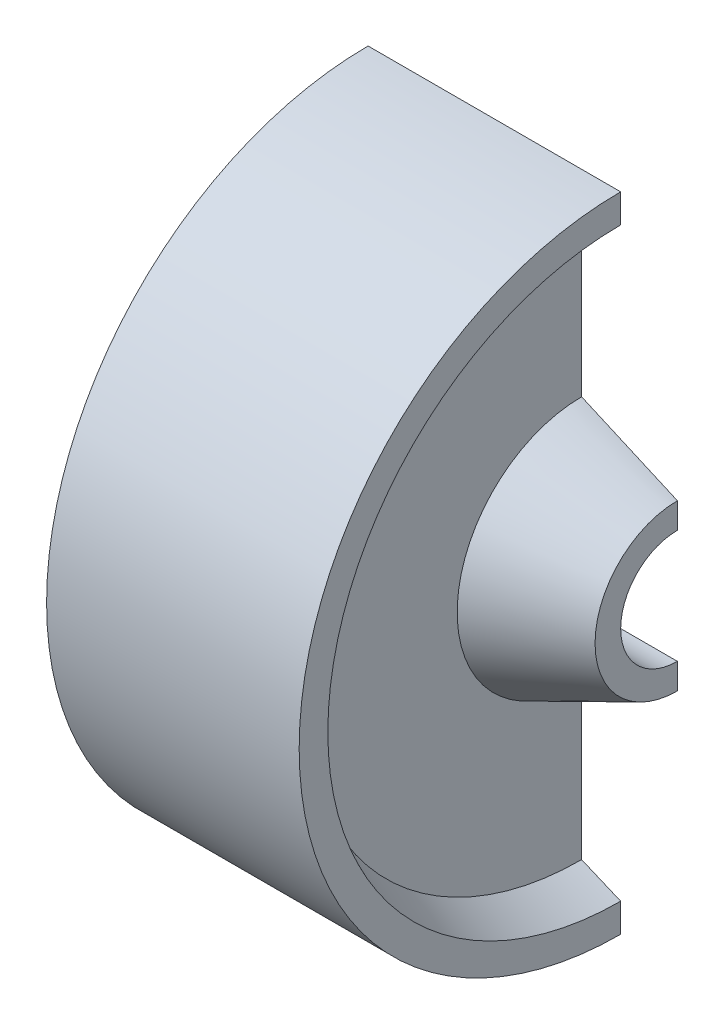
ISO-10303-21;
HEADER;
FILE_DESCRIPTION(('STEP AP214'),'2;1');
FILE_NAME('part.step','',(''),(''),'','','');
FILE_SCHEMA(('AUTOMOTIVE_DESIGN { 1 0 10303 214 1 1 1 1 }'));
ENDSEC;
DATA;
#1=APPLICATION_CONTEXT('core data for automotive mechanical design processes');
#2=APPLICATION_PROTOCOL_DEFINITION('international standard','automotive_design',2000,#1);
#3=PRODUCT_CONTEXT('',#1,'mechanical');
#4=PRODUCT('Part','Part','',(#3));
#5=PRODUCT_RELATED_PRODUCT_CATEGORY('part','',(#4));
#6=PRODUCT_DEFINITION_FORMATION('','',#4);
#7=PRODUCT_DEFINITION_CONTEXT('part definition',#1,'design');
#8=PRODUCT_DEFINITION('design','',#6,#7);
#9=PRODUCT_DEFINITION_SHAPE('','',#8);
#10=(LENGTH_UNIT() NAMED_UNIT(*) SI_UNIT(.MILLI.,.METRE.));
#11=(NAMED_UNIT(*) PLANE_ANGLE_UNIT() SI_UNIT($,.RADIAN.));
#12=(NAMED_UNIT(*) SI_UNIT($,.STERADIAN.) SOLID_ANGLE_UNIT());
#13=UNCERTAINTY_MEASURE_WITH_UNIT(LENGTH_MEASURE(1.E-05),#10,'distance_accuracy_value','');
#14=(GEOMETRIC_REPRESENTATION_CONTEXT(3) GLOBAL_UNCERTAINTY_ASSIGNED_CONTEXT((#13)) GLOBAL_UNIT_ASSIGNED_CONTEXT((#10,
#11,#12)) REPRESENTATION_CONTEXT('',''));
#15=CARTESIAN_POINT('',(0.,0.,0.));
#16=DIRECTION('',(0.,0.,1.));
#17=DIRECTION('',(1.,0.,0.));
#18=AXIS2_PLACEMENT_3D('',#15,#16,#17);
#19=CARTESIAN_POINT('',(61.9764680866145,-19.2127051068383,-1.34161602698444E-13));
#20=DIRECTION('',(-1.,0.,0.));
#21=DIRECTION('',(0.,0.,1.));
#22=AXIS2_PLACEMENT_3D('',#19,#20,#21);
#23=PLANE('',#22);
#24=CARTESIAN_POINT('',(61.9764680866145,0.,0.));
#25=DIRECTION('',(-1.,0.,0.));
#26=DIRECTION('',(0.,0.,1.));
#27=AXIS2_PLACEMENT_3D('',#24,#25,#26);
#28=CIRCLE('',#27,27.889410638975);
#29=CARTESIAN_POINT('',(61.9764680866145,-27.889410638975,-1.94750713594629E-13));
#30=VERTEX_POINT('',#29);
#31=CARTESIAN_POINT('',(61.9764680866145,27.889410638975,0.));
#32=VERTEX_POINT('',#31);
#33=EDGE_CURVE('E11',#30,#32,#28,.T.);
#34=ORIENTED_EDGE('',*,*,#33,.F.);
#35=DIRECTION('',(0.,-1.,0.));
#36=VECTOR('',#35,1.);
#37=CARTESIAN_POINT('',(61.9764680866145,-19.2127051068383,-1.34161602698444E-13));
#38=LINE('',#37,#36);
#39=CARTESIAN_POINT('',(61.9764680866145,-19.2127051068383,-1.34161602698444E-13));
#40=VERTEX_POINT('',#39);
#41=EDGE_CURVE('E170',#40,#30,#38,.T.);
#42=ORIENTED_EDGE('',*,*,#41,.F.);
#43=CARTESIAN_POINT('',(61.9764680866145,0.,0.));
#44=DIRECTION('',(-1.,0.,0.));
#45=DIRECTION('',(0.,0.,1.));
#46=AXIS2_PLACEMENT_3D('',#43,#44,#45);
#47=CIRCLE('',#46,19.2127051068383);
#48=CARTESIAN_POINT('',(61.9764680866145,19.2127051068383,0.));
#49=VERTEX_POINT('',#48);
#50=EDGE_CURVE('E50',#40,#49,#47,.T.);
#51=ORIENTED_EDGE('',*,*,#50,.T.);
#52=DIRECTION('',(0.,1.,0.));
#53=VECTOR('',#52,1.);
#54=CARTESIAN_POINT('',(61.9764680866145,19.2127051068383,0.));
#55=LINE('',#54,#53);
#56=EDGE_CURVE('E134',#49,#32,#55,.T.);
#57=ORIENTED_EDGE('',*,*,#56,.T.);
#58=EDGE_LOOP('',(#34,#42,#51,#57));
#59=FACE_BOUND('',#58,.T.);
#60=ADVANCED_FACE('F35',(#59),#23,.F.);
#61=CARTESIAN_POINT('',(61.9764680866145,0.,0.));
#62=DIRECTION('',(-1.,0.,0.));
#63=DIRECTION('',(0.,0.,1.));
#64=AXIS2_PLACEMENT_3D('',#61,#62,#63);
#65=CONICAL_SURFACE('',#64,27.889410638975,0.414079889128241);
#66=CARTESIAN_POINT('',(29.5421164546196,0.,0.));
#67=DIRECTION('',(-1.,0.,0.));
#68=DIRECTION('',(0.,0.,1.));
#69=AXIS2_PLACEMENT_3D('',#66,#67,#68);
#70=CIRCLE('',#69,42.1439982988964);
#71=CARTESIAN_POINT('',(29.5421164546196,-42.1439982988964,-2.94289967209667E-13));
#72=VERTEX_POINT('',#71);
#73=CARTESIAN_POINT('',(29.5421164546196,42.1439982988964,0.));
#74=VERTEX_POINT('',#73);
#75=EDGE_CURVE('E43',#72,#74,#70,.T.);
#76=ORIENTED_EDGE('',*,*,#75,.F.);
#77=DIRECTION('',(-0.915486912510069,-0.402347751357928,0.));
#78=VECTOR('',#77,1.);
#79=CARTESIAN_POINT('',(61.9764680866145,-27.889410638975,-1.94750713594629E-13));
#80=LINE('',#79,#78);
#81=EDGE_CURVE('E130',#30,#72,#80,.T.);
#82=ORIENTED_EDGE('',*,*,#81,.F.);
#83=ORIENTED_EDGE('',*,*,#33,.T.);
#84=DIRECTION('',(-0.915486912510069,0.402347751357928,0.));
#85=VECTOR('',#84,1.);
#86=CARTESIAN_POINT('',(61.9764680866145,27.889410638975,0.));
#87=LINE('',#86,#85);
#88=EDGE_CURVE('E127',#32,#74,#87,.T.);
#89=ORIENTED_EDGE('',*,*,#88,.T.);
#90=EDGE_LOOP('',(#76,#82,#83,#89));
#91=FACE_BOUND('',#90,.T.);
#92=ADVANCED_FACE('F37',(#91),#65,.T.);
#93=CARTESIAN_POINT('',(29.5421164546196,-42.1439982988964,-2.94289967209667E-13));
#94=DIRECTION('',(-1.,0.,0.));
#95=DIRECTION('',(0.,0.,1.));
#96=AXIS2_PLACEMENT_3D('',#93,#94,#95);
#97=PLANE('',#96);
#98=CARTESIAN_POINT('',(29.5421164546196,0.,0.));
#99=DIRECTION('',(-1.,0.,0.));
#100=DIRECTION('',(0.,0.,1.));
#101=AXIS2_PLACEMENT_3D('',#98,#99,#100);
#102=CIRCLE('',#101,93.5844668107864);
#103=CARTESIAN_POINT('',(29.5421164546196,-93.5844668107864,-6.5349683895089E-13));
#104=VERTEX_POINT('',#103);
#105=CARTESIAN_POINT('',(29.5421164546196,93.5844668107864,0.));
#106=VERTEX_POINT('',#105);
#107=EDGE_CURVE('E218',#104,#106,#102,.T.);
#108=ORIENTED_EDGE('',*,*,#107,.F.);
#109=DIRECTION('',(0.,-1.,0.));
#110=VECTOR('',#109,1.);
#111=CARTESIAN_POINT('',(29.5421164546196,-42.1439982988964,-2.94289967209667E-13));
#112=LINE('',#111,#110);
#113=EDGE_CURVE('E173',#72,#104,#112,.T.);
#114=ORIENTED_EDGE('',*,*,#113,.F.);
#115=ORIENTED_EDGE('',*,*,#75,.T.);
#116=DIRECTION('',(0.,1.,0.));
#117=VECTOR('',#116,1.);
#118=CARTESIAN_POINT('',(29.5421164546196,42.1439982988964,0.));
#119=LINE('',#118,#117);
#120=EDGE_CURVE('E141',#74,#106,#119,.T.);
#121=ORIENTED_EDGE('',*,*,#120,.T.);
#122=EDGE_LOOP('',(#108,#114,#115,#121));
#123=FACE_BOUND('',#122,.T.);
#124=ADVANCED_FACE('F221',(#123),#97,.F.);
#125=CARTESIAN_POINT('',(29.5421164546196,0.,0.));
#126=DIRECTION('',(1.,0.,0.));
#127=DIRECTION('',(0.,0.,-1.));
#128=AXIS2_PLACEMENT_3D('',#125,#126,#127);
#129=CONICAL_SURFACE('',#128,93.5844668107864,0.399220769575252);
#130=CARTESIAN_POINT('',(42.763762979764,0.,0.));
#131=DIRECTION('',(-1.,0.,0.));
#132=DIRECTION('',(0.,0.,1.));
#133=AXIS2_PLACEMENT_3D('',#130,#131,#132);
#134=CIRCLE('',#133,99.1623489385817);
#135=CARTESIAN_POINT('',(42.763762979764,-99.1623489385817,-6.92446981669818E-13));
#136=VERTEX_POINT('',#135);
#137=CARTESIAN_POINT('',(42.763762979764,99.1623489385817,0.));
#138=VERTEX_POINT('',#137);
#139=EDGE_CURVE('E216',#136,#138,#134,.T.);
#140=ORIENTED_EDGE('',*,*,#139,.F.);
#141=DIRECTION('',(0.921364160958329,-0.388700505404295,0.));
#142=VECTOR('',#141,1.);
#143=CARTESIAN_POINT('',(29.5421164546196,-93.5844668107864,-6.5349683895089E-13));
#144=LINE('',#143,#142);
#145=EDGE_CURVE('E176',#104,#136,#144,.T.);
#146=ORIENTED_EDGE('',*,*,#145,.F.);
#147=ORIENTED_EDGE('',*,*,#107,.T.);
#148=DIRECTION('',(0.921364160958329,0.388700505404295,0.));
#149=VECTOR('',#148,1.);
#150=CARTESIAN_POINT('',(29.5421164546196,93.5844668107864,0.));
#151=LINE('',#150,#149);
#152=EDGE_CURVE('E143',#106,#138,#151,.T.);
#153=ORIENTED_EDGE('',*,*,#152,.T.);
#154=EDGE_LOOP('',(#140,#146,#147,#153));
#155=FACE_BOUND('',#154,.T.);
#156=ADVANCED_FACE('F253',(#155),#129,.F.);
#157=CARTESIAN_POINT('',(42.763762979764,-99.1623489385817,-6.92446981669818E-13));
#158=DIRECTION('',(-1.,0.,0.));
#159=DIRECTION('',(0.,0.,1.));
#160=AXIS2_PLACEMENT_3D('',#157,#158,#159);
#161=PLANE('',#160);
#162=CARTESIAN_POINT('',(42.763762979764,0.,0.));
#163=DIRECTION('',(-1.,0.,0.));
#164=DIRECTION('',(0.,0.,1.));
#165=AXIS2_PLACEMENT_3D('',#162,#163,#164);
#166=CIRCLE('',#165,108.871995605485);
#167=CARTESIAN_POINT('',(42.763762979764,-108.871995605485,-7.60249081958322E-13));
#168=VERTEX_POINT('',#167);
#169=CARTESIAN_POINT('',(42.763762979764,108.871995605485,0.));
#170=VERTEX_POINT('',#169);
#171=EDGE_CURVE('E214',#168,#170,#166,.T.);
#172=ORIENTED_EDGE('',*,*,#171,.F.);
#173=DIRECTION('',(0.,-1.,0.));
#174=VECTOR('',#173,1.);
#175=CARTESIAN_POINT('',(42.763762979764,-99.1623489385817,-6.92446981669818E-13));
#176=LINE('',#175,#174);
#177=EDGE_CURVE('E179',#136,#168,#176,.T.);
#178=ORIENTED_EDGE('',*,*,#177,.F.);
#179=ORIENTED_EDGE('',*,*,#139,.T.);
#180=DIRECTION('',(0.,1.,0.));
#181=VECTOR('',#180,1.);
#182=CARTESIAN_POINT('',(42.763762979764,99.1623489385817,0.));
#183=LINE('',#182,#181);
#184=EDGE_CURVE('E148',#138,#170,#183,.T.);
#185=ORIENTED_EDGE('',*,*,#184,.T.);
#186=EDGE_LOOP('',(#172,#178,#179,#185));
#187=FACE_BOUND('',#186,.T.);
#188=ADVANCED_FACE('F251',(#187),#161,.F.);
#189=CARTESIAN_POINT('',(0.,0.,0.));
#190=DIRECTION('',(-1.,0.,0.));
#191=DIRECTION('',(0.,0.,1.));
#192=AXIS2_PLACEMENT_3D('',#189,#190,#191);
#193=CYLINDRICAL_SURFACE('',#192,108.871995605485);
#194=CARTESIAN_POINT('',(-42.763762979764,0.,0.));
#195=DIRECTION('',(-1.,0.,0.));
#196=DIRECTION('',(0.,0.,1.));
#197=AXIS2_PLACEMENT_3D('',#194,#195,#196);
#198=CIRCLE('',#197,108.871995605485);
#199=CARTESIAN_POINT('',(-42.763762979764,-108.871995605485,-7.60249081958322E-13));
#200=VERTEX_POINT('',#199);
#201=CARTESIAN_POINT('',(-42.763762979764,108.871995605485,0.));
#202=VERTEX_POINT('',#201);
#203=EDGE_CURVE('E212',#200,#202,#198,.T.);
#204=ORIENTED_EDGE('',*,*,#203,.F.);
#205=DIRECTION('',(-1.,0.,0.));
#206=VECTOR('',#205,1.);
#207=CARTESIAN_POINT('',(42.763762979764,-108.871995605485,-7.60249081958322E-13));
#208=LINE('',#207,#206);
#209=EDGE_CURVE('E182',#168,#200,#208,.T.);
#210=ORIENTED_EDGE('',*,*,#209,.F.);
#211=ORIENTED_EDGE('',*,*,#171,.T.);
#212=DIRECTION('',(-1.,0.,0.));
#213=VECTOR('',#212,1.);
#214=CARTESIAN_POINT('',(42.763762979764,108.871995605485,0.));
#215=LINE('',#214,#213);
#216=EDGE_CURVE('E151',#170,#202,#215,.T.);
#217=ORIENTED_EDGE('',*,*,#216,.T.);
#218=EDGE_LOOP('',(#204,#210,#211,#217));
#219=FACE_BOUND('',#218,.T.);
#220=ADVANCED_FACE('F248',(#219),#193,.T.);
#221=CARTESIAN_POINT('',(-42.763762979764,-99.1623489385817,-6.92446981669818E-13));
#222=DIRECTION('',(1.,0.,0.));
#223=DIRECTION('',(0.,0.,-1.));
#224=AXIS2_PLACEMENT_3D('',#221,#222,#223);
#225=PLANE('',#224);
#226=CARTESIAN_POINT('',(-42.763762979764,0.,0.));
#227=DIRECTION('',(-1.,0.,0.));
#228=DIRECTION('',(0.,0.,1.));
#229=AXIS2_PLACEMENT_3D('',#226,#227,#228);
#230=CIRCLE('',#229,99.1623489385817);
#231=CARTESIAN_POINT('',(-42.763762979764,-99.1623489385817,-6.92446981669818E-13));
#232=VERTEX_POINT('',#231);
#233=CARTESIAN_POINT('',(-42.763762979764,99.1623489385817,0.));
#234=VERTEX_POINT('',#233);
#235=EDGE_CURVE('E210',#232,#234,#230,.T.);
#236=ORIENTED_EDGE('',*,*,#235,.F.);
#237=DIRECTION('',(0.,1.,0.));
#238=VECTOR('',#237,1.);
#239=CARTESIAN_POINT('',(-42.763762979764,-99.1623489385817,-6.92446981669818E-13));
#240=LINE('',#239,#238);
#241=EDGE_CURVE('E185',#200,#232,#240,.T.);
#242=ORIENTED_EDGE('',*,*,#241,.F.);
#243=ORIENTED_EDGE('',*,*,#203,.T.);
#244=DIRECTION('',(0.,-1.,0.));
#245=VECTOR('',#244,1.);
#246=CARTESIAN_POINT('',(-42.763762979764,99.1623489385817,0.));
#247=LINE('',#246,#245);
#248=EDGE_CURVE('E154',#202,#234,#247,.T.);
#249=ORIENTED_EDGE('',*,*,#248,.T.);
#250=EDGE_LOOP('',(#236,#242,#243,#249));
#251=FACE_BOUND('',#250,.T.);
#252=ADVANCED_FACE('F244',(#251),#225,.F.);
#253=CARTESIAN_POINT('',(-42.763762979764,0.,0.));
#254=DIRECTION('',(-1.,0.,0.));
#255=DIRECTION('',(0.,0.,1.));
#256=AXIS2_PLACEMENT_3D('',#253,#254,#255);
#257=CONICAL_SURFACE('',#256,99.1623489385817,0.399220769575252);
#258=CARTESIAN_POINT('',(-29.5421164546196,0.,0.));
#259=DIRECTION('',(-1.,0.,0.));
#260=DIRECTION('',(0.,0.,1.));
#261=AXIS2_PLACEMENT_3D('',#258,#259,#260);
#262=CIRCLE('',#261,93.5844668107864);
#263=CARTESIAN_POINT('',(-29.5421164546196,-93.5844668107864,-6.5349683895089E-13));
#264=VERTEX_POINT('',#263);
#265=CARTESIAN_POINT('',(-29.5421164546196,93.5844668107864,0.));
#266=VERTEX_POINT('',#265);
#267=EDGE_CURVE('E208',#264,#266,#262,.T.);
#268=ORIENTED_EDGE('',*,*,#267,.F.);
#269=DIRECTION('',(0.921364160958329,0.388700505404295,0.));
#270=VECTOR('',#269,1.);
#271=CARTESIAN_POINT('',(-29.5421164546196,-93.5844668107864,-6.5349683895089E-13));
#272=LINE('',#271,#270);
#273=EDGE_CURVE('E188',#232,#264,#272,.T.);
#274=ORIENTED_EDGE('',*,*,#273,.F.);
#275=ORIENTED_EDGE('',*,*,#235,.T.);
#276=DIRECTION('',(0.921364160958329,-0.388700505404295,0.));
#277=VECTOR('',#276,1.);
#278=CARTESIAN_POINT('',(-29.5421164546196,93.5844668107864,0.));
#279=LINE('',#278,#277);
#280=EDGE_CURVE('E157',#234,#266,#279,.T.);
#281=ORIENTED_EDGE('',*,*,#280,.T.);
#282=EDGE_LOOP('',(#268,#274,#275,#281));
#283=FACE_BOUND('',#282,.T.);
#284=ADVANCED_FACE('F239',(#283),#257,.F.);
#285=CARTESIAN_POINT('',(-29.5421164546196,-42.1439982988964,-2.94289967209667E-13));
#286=DIRECTION('',(1.,0.,0.));
#287=DIRECTION('',(0.,0.,-1.));
#288=AXIS2_PLACEMENT_3D('',#285,#286,#287);
#289=PLANE('',#288);
#290=CARTESIAN_POINT('',(-29.5421164546196,0.,0.));
#291=DIRECTION('',(-1.,0.,0.));
#292=DIRECTION('',(0.,0.,1.));
#293=AXIS2_PLACEMENT_3D('',#290,#291,#292);
#294=CIRCLE('',#293,42.1439982988964);
#295=CARTESIAN_POINT('',(-29.5421164546196,-42.1439982988964,-2.94289967209667E-13));
#296=VERTEX_POINT('',#295);
#297=CARTESIAN_POINT('',(-29.5421164546196,42.1439982988964,0.));
#298=VERTEX_POINT('',#297);
#299=EDGE_CURVE('E206',#296,#298,#294,.T.);
#300=ORIENTED_EDGE('',*,*,#299,.F.);
#301=DIRECTION('',(0.,1.,0.));
#302=VECTOR('',#301,1.);
#303=CARTESIAN_POINT('',(-29.5421164546196,-42.1439982988964,-2.94289967209667E-13));
#304=LINE('',#303,#302);
#305=EDGE_CURVE('E191',#264,#296,#304,.T.);
#306=ORIENTED_EDGE('',*,*,#305,.F.);
#307=ORIENTED_EDGE('',*,*,#267,.T.);
#308=DIRECTION('',(0.,-1.,0.));
#309=VECTOR('',#308,1.);
#310=CARTESIAN_POINT('',(-29.5421164546196,42.1439982988964,0.));
#311=LINE('',#310,#309);
#312=EDGE_CURVE('E160',#266,#298,#311,.T.);
#313=ORIENTED_EDGE('',*,*,#312,.T.);
#314=EDGE_LOOP('',(#300,#306,#307,#313));
#315=FACE_BOUND('',#314,.T.);
#316=ADVANCED_FACE('F236',(#315),#289,.F.);
#317=CARTESIAN_POINT('',(-29.5421164546196,0.,0.));
#318=DIRECTION('',(1.,0.,0.));
#319=DIRECTION('',(0.,0.,-1.));
#320=AXIS2_PLACEMENT_3D('',#317,#318,#319);
#321=CONICAL_SURFACE('',#320,42.1439982988964,0.414079889128241);
#322=CARTESIAN_POINT('',(-61.9764680866145,0.,0.));
#323=DIRECTION('',(-1.,0.,0.));
#324=DIRECTION('',(0.,0.,1.));
#325=AXIS2_PLACEMENT_3D('',#322,#323,#324);
#326=CIRCLE('',#325,27.889410638975);
#327=CARTESIAN_POINT('',(-61.9764680866145,-27.889410638975,-1.94750713594629E-13));
#328=VERTEX_POINT('',#327);
#329=CARTESIAN_POINT('',(-61.9764680866145,27.889410638975,0.));
#330=VERTEX_POINT('',#329);
#331=EDGE_CURVE('E204',#328,#330,#326,.T.);
#332=ORIENTED_EDGE('',*,*,#331,.F.);
#333=DIRECTION('',(-0.915486912510069,0.402347751357928,0.));
#334=VECTOR('',#333,1.);
#335=CARTESIAN_POINT('',(-61.9764680866145,-27.889410638975,-1.94750713594629E-13));
#336=LINE('',#335,#334);
#337=EDGE_CURVE('E194',#296,#328,#336,.T.);
#338=ORIENTED_EDGE('',*,*,#337,.F.);
#339=ORIENTED_EDGE('',*,*,#299,.T.);
#340=DIRECTION('',(-0.915486912510069,-0.402347751357928,0.));
#341=VECTOR('',#340,1.);
#342=CARTESIAN_POINT('',(-61.9764680866145,27.889410638975,0.));
#343=LINE('',#342,#341);
#344=EDGE_CURVE('E163',#298,#330,#343,.T.);
#345=ORIENTED_EDGE('',*,*,#344,.T.);
#346=EDGE_LOOP('',(#332,#338,#339,#345));
#347=FACE_BOUND('',#346,.T.);
#348=ADVANCED_FACE('F232',(#347),#321,.T.);
#349=CARTESIAN_POINT('',(-61.9764680866145,-19.2127051068383,-1.34161602698444E-13));
#350=DIRECTION('',(1.,0.,0.));
#351=DIRECTION('',(0.,0.,-1.));
#352=AXIS2_PLACEMENT_3D('',#349,#350,#351);
#353=PLANE('',#352);
#354=CARTESIAN_POINT('',(-61.9764680866145,0.,0.));
#355=DIRECTION('',(-1.,0.,0.));
#356=DIRECTION('',(0.,0.,1.));
#357=AXIS2_PLACEMENT_3D('',#354,#355,#356);
#358=CIRCLE('',#357,19.2127051068383);
#359=CARTESIAN_POINT('',(-61.9764680866145,-19.2127051068383,-1.34161602698444E-13));
#360=VERTEX_POINT('',#359);
#361=CARTESIAN_POINT('',(-61.9764680866145,19.2127051068383,0.));
#362=VERTEX_POINT('',#361);
#363=EDGE_CURVE('E58',#360,#362,#358,.T.);
#364=ORIENTED_EDGE('',*,*,#363,.F.);
#365=DIRECTION('',(0.,1.,0.));
#366=VECTOR('',#365,1.);
#367=CARTESIAN_POINT('',(-61.9764680866145,-19.2127051068383,-1.34161602698444E-13));
#368=LINE('',#367,#366);
#369=EDGE_CURVE('E197',#328,#360,#368,.T.);
#370=ORIENTED_EDGE('',*,*,#369,.F.);
#371=ORIENTED_EDGE('',*,*,#331,.T.);
#372=DIRECTION('',(0.,-1.,0.));
#373=VECTOR('',#372,1.);
#374=CARTESIAN_POINT('',(-61.9764680866145,19.2127051068383,0.));
#375=LINE('',#374,#373);
#376=EDGE_CURVE('E166',#330,#362,#375,.T.);
#377=ORIENTED_EDGE('',*,*,#376,.T.);
#378=EDGE_LOOP('',(#364,#370,#371,#377));
#379=FACE_BOUND('',#378,.T.);
#380=ADVANCED_FACE('F227',(#379),#353,.F.);
#381=CARTESIAN_POINT('',(0.,0.,0.));
#382=DIRECTION('',(-1.,0.,0.));
#383=DIRECTION('',(0.,0.,1.));
#384=AXIS2_PLACEMENT_3D('',#381,#382,#383);
#385=CYLINDRICAL_SURFACE('',#384,19.2127051068383);
#386=DIRECTION('',(1.,0.,0.));
#387=VECTOR('',#386,1.);
#388=CARTESIAN_POINT('',(-61.9764680866145,-19.2127051068383,-1.34161602698444E-13));
#389=LINE('',#388,#387);
#390=EDGE_CURVE('E199',#360,#40,#389,.T.);
#391=ORIENTED_EDGE('',*,*,#390,.F.);
#392=ORIENTED_EDGE('',*,*,#363,.T.);
#393=DIRECTION('',(1.,0.,0.));
#394=VECTOR('',#393,1.);
#395=CARTESIAN_POINT('',(-61.9764680866145,19.2127051068383,0.));
#396=LINE('',#395,#394);
#397=EDGE_CURVE('E168',#362,#49,#396,.T.);
#398=ORIENTED_EDGE('',*,*,#397,.T.);
#399=ORIENTED_EDGE('',*,*,#50,.F.);
#400=EDGE_LOOP('',(#391,#392,#398,#399));
#401=FACE_BOUND('',#400,.T.);
#402=ADVANCED_FACE('F225',(#401),#385,.F.);
#403=CARTESIAN_POINT('',(0.,0.,0.));
#404=DIRECTION('',(0.,0.,-1.));
#405=DIRECTION('',(1.,0.,0.));
#406=AXIS2_PLACEMENT_3D('',#403,#404,#405);
#407=PLANE('',#406);
#408=ORIENTED_EDGE('',*,*,#41,.T.);
#409=ORIENTED_EDGE('',*,*,#81,.T.);
#410=ORIENTED_EDGE('',*,*,#113,.T.);
#411=ORIENTED_EDGE('',*,*,#145,.T.);
#412=ORIENTED_EDGE('',*,*,#177,.T.);
#413=ORIENTED_EDGE('',*,*,#209,.T.);
#414=ORIENTED_EDGE('',*,*,#241,.T.);
#415=ORIENTED_EDGE('',*,*,#273,.T.);
#416=ORIENTED_EDGE('',*,*,#305,.T.);
#417=ORIENTED_EDGE('',*,*,#337,.T.);
#418=ORIENTED_EDGE('',*,*,#369,.T.);
#419=ORIENTED_EDGE('',*,*,#390,.T.);
#420=EDGE_LOOP('',(#408,#409,#410,#411,#412,#413,#414,#415,#416,#417,#418,#419));
#421=FACE_BOUND('',#420,.T.);
#422=ADVANCED_FACE('F223',(#421),#407,.T.);
#423=CARTESIAN_POINT('',(0.,0.,0.));
#424=DIRECTION('',(0.,0.,1.));
#425=DIRECTION('',(1.,0.,0.));
#426=AXIS2_PLACEMENT_3D('',#423,#424,#425);
#427=PLANE('',#426);
#428=ORIENTED_EDGE('',*,*,#56,.F.);
#429=ORIENTED_EDGE('',*,*,#397,.F.);
#430=ORIENTED_EDGE('',*,*,#376,.F.);
#431=ORIENTED_EDGE('',*,*,#344,.F.);
#432=ORIENTED_EDGE('',*,*,#312,.F.);
#433=ORIENTED_EDGE('',*,*,#280,.F.);
#434=ORIENTED_EDGE('',*,*,#248,.F.);
#435=ORIENTED_EDGE('',*,*,#216,.F.);
#436=ORIENTED_EDGE('',*,*,#184,.F.);
#437=ORIENTED_EDGE('',*,*,#152,.F.);
#438=ORIENTED_EDGE('',*,*,#120,.F.);
#439=ORIENTED_EDGE('',*,*,#88,.F.);
#440=EDGE_LOOP('',(#428,#429,#430,#431,#432,#433,#434,#435,#436,#437,#438,#439));
#441=FACE_BOUND('',#440,.T.);
#442=ADVANCED_FACE('F138',(#441),#427,.F.);
#443=CLOSED_SHELL('',(#60,#92,#124,#156,#188,#220,#252,#284,#316,#348,#380,#402,#422,#442));
#444=MANIFOLD_SOLID_BREP('B2',#443);
#445=ADVANCED_BREP_SHAPE_REPRESENTATION('',(#18,#444),#14);
#446=SHAPE_DEFINITION_REPRESENTATION(#9,#445);
ENDSEC;
END-ISO-10303-21;
